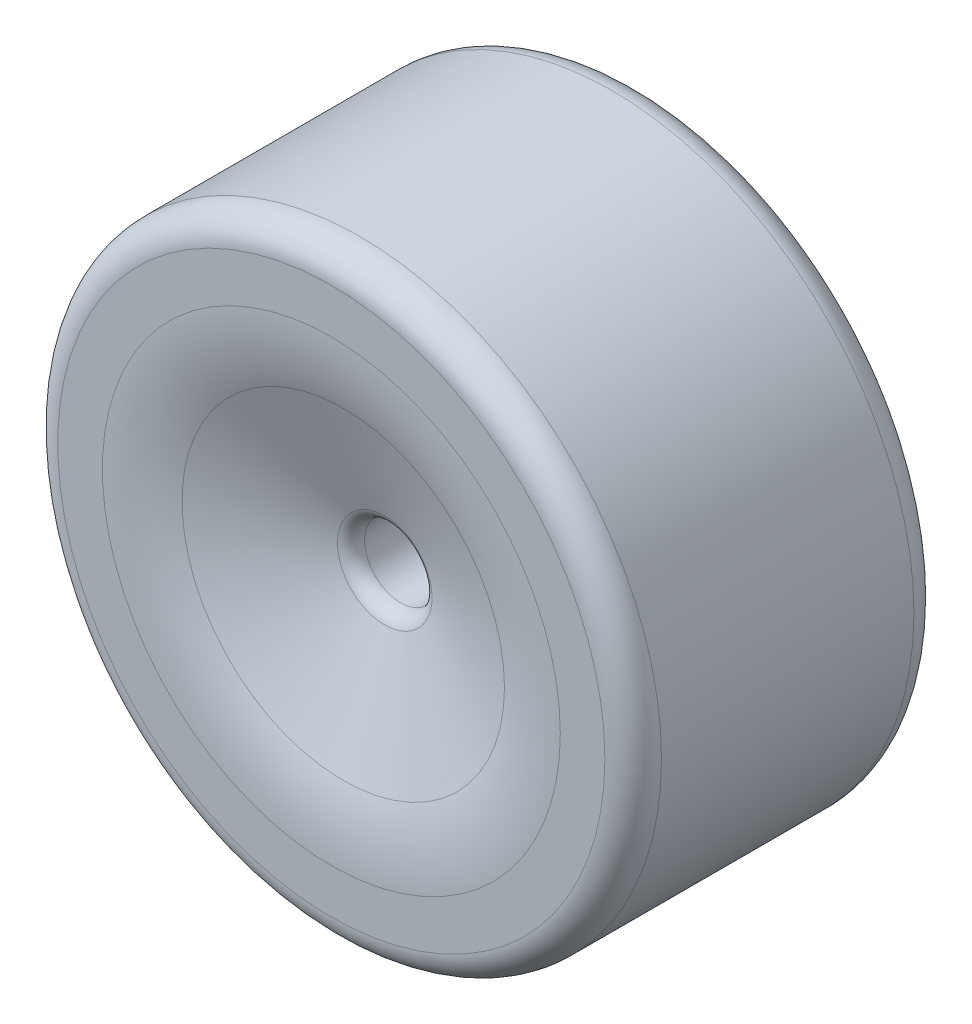
ISO-10303-21;
HEADER;
FILE_DESCRIPTION(('STEP AP214'),'2;1');
FILE_NAME('part.step','',(''),(''),'','','');
FILE_SCHEMA(('AUTOMOTIVE_DESIGN { 1 0 10303 214 1 1 1 1 }'));
ENDSEC;
DATA;
#1=APPLICATION_CONTEXT('core data for automotive mechanical design processes');
#2=APPLICATION_PROTOCOL_DEFINITION('international standard','automotive_design',2000,#1);
#3=PRODUCT_CONTEXT('',#1,'mechanical');
#4=PRODUCT('Part','Part','',(#3));
#5=PRODUCT_RELATED_PRODUCT_CATEGORY('part','',(#4));
#6=PRODUCT_DEFINITION_FORMATION('','',#4);
#7=PRODUCT_DEFINITION_CONTEXT('part definition',#1,'design');
#8=PRODUCT_DEFINITION('design','',#6,#7);
#9=PRODUCT_DEFINITION_SHAPE('','',#8);
#10=(LENGTH_UNIT() NAMED_UNIT(*) SI_UNIT(.MILLI.,.METRE.));
#11=(NAMED_UNIT(*) PLANE_ANGLE_UNIT() SI_UNIT($,.RADIAN.));
#12=(NAMED_UNIT(*) SI_UNIT($,.STERADIAN.) SOLID_ANGLE_UNIT());
#13=UNCERTAINTY_MEASURE_WITH_UNIT(LENGTH_MEASURE(1.E-05),#10,'distance_accuracy_value','');
#14=(GEOMETRIC_REPRESENTATION_CONTEXT(3) GLOBAL_UNCERTAINTY_ASSIGNED_CONTEXT((#13)) GLOBAL_UNIT_ASSIGNED_CONTEXT((#10,
#11,#12)) REPRESENTATION_CONTEXT('',''));
#15=CARTESIAN_POINT('',(0.,0.,0.));
#16=DIRECTION('',(0.,0.,1.));
#17=DIRECTION('',(1.,0.,0.));
#18=AXIS2_PLACEMENT_3D('',#15,#16,#17);
#19=CARTESIAN_POINT('',(0.,0.,54.61));
#20=DIRECTION('',(0.,0.,-1.));
#21=DIRECTION('',(-1.,0.,0.));
#22=AXIS2_PLACEMENT_3D('',#19,#20,#21);
#23=CYLINDRICAL_SURFACE('',#22,53.34);
#24=CARTESIAN_POINT('',(0.,0.,5.));
#25=DIRECTION('',(0.,0.,1.));
#26=DIRECTION('',(1.,0.,0.));
#27=AXIS2_PLACEMENT_3D('',#24,#25,#26);
#28=CIRCLE('',#27,53.34);
#29=CARTESIAN_POINT('',(53.34,0.,5.));
#30=VERTEX_POINT('',#29);
#31=EDGE_CURVE('E61',#30,#30,#28,.T.);
#32=ORIENTED_EDGE('',*,*,#31,.T.);
#33=EDGE_LOOP('',(#32));
#34=FACE_BOUND('',#33,.T.);
#35=CARTESIAN_POINT('',(0.,0.,49.61));
#36=DIRECTION('',(0.,0.,1.));
#37=DIRECTION('',(1.,0.,0.));
#38=AXIS2_PLACEMENT_3D('',#35,#36,#37);
#39=CIRCLE('',#38,53.34);
#40=CARTESIAN_POINT('',(53.34,0.,49.61));
#41=VERTEX_POINT('',#40);
#42=EDGE_CURVE('E64',#41,#41,#39,.F.);
#43=ORIENTED_EDGE('',*,*,#42,.T.);
#44=EDGE_LOOP('',(#43));
#45=FACE_BOUND('',#44,.T.);
#46=ADVANCED_FACE('F29',(#34,#45),#23,.T.);
#47=CARTESIAN_POINT('',(0.,0.,54.61));
#48=DIRECTION('',(0.,0.,1.));
#49=DIRECTION('',(1.,0.,0.));
#50=AXIS2_PLACEMENT_3D('',#47,#48,#49);
#51=PLANE('',#50);
#52=CARTESIAN_POINT('',(0.,0.,54.61));
#53=DIRECTION('',(0.,0.,1.));
#54=DIRECTION('',(1.,0.,0.));
#55=AXIS2_PLACEMENT_3D('',#52,#53,#54);
#56=CIRCLE('',#55,40.4614443247963);
#57=CARTESIAN_POINT('',(40.4614443247963,0.,54.61));
#58=VERTEX_POINT('',#57);
#59=EDGE_CURVE('E40',#58,#58,#56,.F.);
#60=ORIENTED_EDGE('',*,*,#59,.T.);
#61=EDGE_LOOP('',(#60));
#62=FACE_BOUND('',#61,.T.);
#63=CARTESIAN_POINT('',(0.,0.,54.61));
#64=DIRECTION('',(0.,0.,1.));
#65=DIRECTION('',(1.,0.,0.));
#66=AXIS2_PLACEMENT_3D('',#63,#64,#65);
#67=CIRCLE('',#66,48.34);
#68=CARTESIAN_POINT('',(48.34,0.,54.61));
#69=VERTEX_POINT('',#68);
#70=EDGE_CURVE('E55',#69,#69,#67,.T.);
#71=ORIENTED_EDGE('',*,*,#70,.T.);
#72=EDGE_LOOP('',(#71));
#73=FACE_BOUND('',#72,.T.);
#74=ADVANCED_FACE('F89',(#62,#73),#51,.T.);
#75=CARTESIAN_POINT('',(0.,0.,0.));
#76=DIRECTION('',(0.,0.,1.));
#77=DIRECTION('',(1.,0.,0.));
#78=AXIS2_PLACEMENT_3D('',#75,#76,#77);
#79=PLANE('',#78);
#80=CARTESIAN_POINT('',(0.,0.,0.));
#81=DIRECTION('',(0.,0.,1.));
#82=DIRECTION('',(1.,0.,0.));
#83=AXIS2_PLACEMENT_3D('',#80,#81,#82);
#84=CIRCLE('',#83,29.432);
#85=CARTESIAN_POINT('',(29.432,0.,0.));
#86=VERTEX_POINT('',#85);
#87=EDGE_CURVE('E49',#86,#86,#84,.T.);
#88=ORIENTED_EDGE('',*,*,#87,.T.);
#89=EDGE_LOOP('',(#88));
#90=FACE_BOUND('',#89,.T.);
#91=CARTESIAN_POINT('',(0.,0.,0.));
#92=DIRECTION('',(0.,0.,1.));
#93=DIRECTION('',(1.,0.,0.));
#94=AXIS2_PLACEMENT_3D('',#91,#92,#93);
#95=CIRCLE('',#94,48.34);
#96=CARTESIAN_POINT('',(48.34,0.,0.));
#97=VERTEX_POINT('',#96);
#98=EDGE_CURVE('E58',#97,#97,#95,.F.);
#99=ORIENTED_EDGE('',*,*,#98,.T.);
#100=EDGE_LOOP('',(#99));
#101=FACE_BOUND('',#100,.T.);
#102=ADVANCED_FACE('F95',(#90,#101),#79,.F.);
#103=CARTESIAN_POINT('',(0.,0.,5.));
#104=DIRECTION('',(0.,0.,1.));
#105=DIRECTION('',(1.,0.,0.));
#106=AXIS2_PLACEMENT_3D('',#103,#104,#105);
#107=TOROIDAL_SURFACE('',#106,48.34,5.);
#108=ORIENTED_EDGE('',*,*,#98,.F.);
#109=EDGE_LOOP('',(#108));
#110=FACE_BOUND('',#109,.T.);
#111=ORIENTED_EDGE('',*,*,#31,.F.);
#112=EDGE_LOOP('',(#111));
#113=FACE_BOUND('',#112,.T.);
#114=ADVANCED_FACE('F101',(#110,#113),#107,.T.);
#115=CARTESIAN_POINT('',(0.,0.,49.61));
#116=DIRECTION('',(0.,0.,1.));
#117=DIRECTION('',(1.,0.,0.));
#118=AXIS2_PLACEMENT_3D('',#115,#116,#117);
#119=TOROIDAL_SURFACE('',#118,48.34,5.);
#120=ORIENTED_EDGE('',*,*,#42,.F.);
#121=EDGE_LOOP('',(#120));
#122=FACE_BOUND('',#121,.T.);
#123=ORIENTED_EDGE('',*,*,#70,.F.);
#124=EDGE_LOOP('',(#123));
#125=FACE_BOUND('',#124,.T.);
#126=ADVANCED_FACE('F104',(#122,#125),#119,.T.);
#127=CARTESIAN_POINT('',(0.,0.,17.78));
#128=DIRECTION('',(0.,0.,-1.));
#129=DIRECTION('',(-1.,0.,0.));
#130=AXIS2_PLACEMENT_3D('',#127,#128,#129);
#131=CYLINDRICAL_SURFACE('',#130,27.432);
#132=CARTESIAN_POINT('',(0.,0.,2.));
#133=DIRECTION('',(0.,0.,1.));
#134=DIRECTION('',(1.,0.,0.));
#135=AXIS2_PLACEMENT_3D('',#132,#133,#134);
#136=CIRCLE('',#135,27.432);
#137=CARTESIAN_POINT('',(27.432,0.,2.));
#138=VERTEX_POINT('',#137);
#139=EDGE_CURVE('E52',#138,#138,#136,.F.);
#140=ORIENTED_EDGE('',*,*,#139,.T.);
#141=EDGE_LOOP('',(#140));
#142=FACE_BOUND('',#141,.T.);
#143=CARTESIAN_POINT('',(0.,0.,17.78));
#144=DIRECTION('',(0.,0.,-1.));
#145=DIRECTION('',(-1.,0.,0.));
#146=AXIS2_PLACEMENT_3D('',#143,#144,#145);
#147=CIRCLE('',#146,27.432);
#148=CARTESIAN_POINT('',(-27.432,0.,17.78));
#149=VERTEX_POINT('',#148);
#150=EDGE_CURVE('E67',#149,#149,#147,.T.);
#151=ORIENTED_EDGE('',*,*,#150,.F.);
#152=EDGE_LOOP('',(#151));
#153=FACE_BOUND('',#152,.T.);
#154=ADVANCED_FACE('F108',(#142,#153),#131,.F.);
#155=CARTESIAN_POINT('',(0.,0.,17.78));
#156=DIRECTION('',(0.,0.,-1.));
#157=DIRECTION('',(-1.,0.,0.));
#158=AXIS2_PLACEMENT_3D('',#155,#156,#157);
#159=PLANE('',#158);
#160=ORIENTED_EDGE('',*,*,#150,.T.);
#161=EDGE_LOOP('',(#160));
#162=FACE_BOUND('',#161,.T.);
#163=ADVANCED_FACE('F112',(#162),#159,.T.);
#164=CARTESIAN_POINT('',(0.,0.,2.));
#165=DIRECTION('',(0.,0.,1.));
#166=DIRECTION('',(1.,0.,0.));
#167=AXIS2_PLACEMENT_3D('',#164,#165,#166);
#168=TOROIDAL_SURFACE('',#167,29.432,2.);
#169=ORIENTED_EDGE('',*,*,#87,.F.);
#170=EDGE_LOOP('',(#169));
#171=FACE_BOUND('',#170,.T.);
#172=ORIENTED_EDGE('',*,*,#139,.F.);
#173=EDGE_LOOP('',(#172));
#174=FACE_BOUND('',#173,.T.);
#175=ADVANCED_FACE('F110',(#171,#174),#168,.T.);
#176=CARTESIAN_POINT('',(0.,0.,54.61));
#177=DIRECTION('',(0.,0.,1.));
#178=DIRECTION('',(1.,0.,0.));
#179=AXIS2_PLACEMENT_3D('',#176,#177,#178);
#180=CONICAL_SURFACE('',#179,34.29,1.22173047639603);
#181=CARTESIAN_POINT('',(0.,0.,45.1684552477286));
#182=DIRECTION('',(0.,0.,-1.));
#183=DIRECTION('',(-1.,0.,0.));
#184=AXIS2_PLACEMENT_3D('',#181,#182,#183);
#185=CIRCLE('',#184,8.34956898836392);
#186=CARTESIAN_POINT('',(8.34956898836393,0.,45.1684552477286));
#187=VERTEX_POINT('',#186);
#188=EDGE_CURVE('E10',#187,#187,#185,.T.);
#189=CARTESIAN_POINT('',(0.,0.,52.4992417275068));
#190=DIRECTION('',(0.,0.,1.));
#191=DIRECTION('',(1.,0.,0.));
#192=AXIS2_PLACEMENT_3D('',#189,#190,#191);
#193=CIRCLE('',#192,28.4907393083979);
#194=CARTESIAN_POINT('',(28.4907393083979,0.,52.4992417275068));
#195=VERTEX_POINT('',#194);
#196=EDGE_CURVE('E44',#195,#195,#193,.T.);
#197=CARTESIAN_POINT('',(8.34956898836393,0.,45.1684552477286));
#198=CARTESIAN_POINT('',(8.55937284586429,0.,45.244817606893));
#199=CARTESIAN_POINT('',(8.76917670336464,0.,45.3211799660573));
#200=CARTESIAN_POINT('',(9.18878441836534,0.,45.473904684386));
#201=CARTESIAN_POINT('',(9.3985882758657,0.,45.5502670435504));
#202=CARTESIAN_POINT('',(9.81819599086641,0.,45.7029917618791));
#203=CARTESIAN_POINT('',(10.0279998483668,0.,45.7793541210434));
#204=CARTESIAN_POINT('',(10.4476075633675,0.,45.9320788393722));
#205=CARTESIAN_POINT('',(10.6574114208678,0.,46.0084411985365));
#206=CARTESIAN_POINT('',(11.0770191358685,0.,46.1611659168652));
#207=CARTESIAN_POINT('',(11.2868229933689,0.,46.2375282760296));
#208=CARTESIAN_POINT('',(11.7064307083696,0.,46.3902529943583));
#209=CARTESIAN_POINT('',(11.9162345658699,0.,46.4666153535226));
#210=CARTESIAN_POINT('',(12.3358422808707,0.,46.6193400718514));
#211=CARTESIAN_POINT('',(12.545646138371,0.,46.6957024310157));
#212=CARTESIAN_POINT('',(12.9652538533717,0.,46.8484271493444));
#213=CARTESIAN_POINT('',(13.1750577108721,0.,46.9247895085088));
#214=CARTESIAN_POINT('',(13.5946654258728,0.,47.0775142268375));
#215=CARTESIAN_POINT('',(13.8044692833731,0.,47.1538765860019));
#216=CARTESIAN_POINT('',(14.2240769983738,0.,47.3066013043306));
#217=CARTESIAN_POINT('',(14.4338808558742,0.,47.3829636634949));
#218=CARTESIAN_POINT('',(14.8534885708749,0.,47.5356883818236));
#219=CARTESIAN_POINT('',(15.0632924283752,0.,47.612050740988));
#220=CARTESIAN_POINT('',(15.482900143376,0.,47.7647754593167));
#221=CARTESIAN_POINT('',(15.6927040008763,0.,47.8411378184811));
#222=CARTESIAN_POINT('',(16.112311715877,0.,47.9938625368098));
#223=CARTESIAN_POINT('',(16.3221155733774,0.,48.0702248959741));
#224=CARTESIAN_POINT('',(16.7417232883781,0.,48.2229496143028));
#225=CARTESIAN_POINT('',(16.9515271458784,0.,48.2993119734672));
#226=CARTESIAN_POINT('',(17.3711348608791,0.,48.4520366917959));
#227=CARTESIAN_POINT('',(17.5809387183795,0.,48.5283990509603));
#228=CARTESIAN_POINT('',(18.0005464333802,0.,48.681123769289));
#229=CARTESIAN_POINT('',(18.2103502908806,0.,48.7574861284533));
#230=CARTESIAN_POINT('',(18.6299580058813,0.,48.910210846782));
#231=CARTESIAN_POINT('',(18.8397618633816,0.,48.9865732059464));
#232=CARTESIAN_POINT('',(19.2593695783823,0.,49.1392979242751));
#233=CARTESIAN_POINT('',(19.4691734358827,0.,49.2156602834395));
#234=CARTESIAN_POINT('',(19.8887811508834,0.,49.3683850017682));
#235=CARTESIAN_POINT('',(20.0985850083837,0.,49.4447473609326));
#236=CARTESIAN_POINT('',(20.5181927233844,0.,49.5974720792613));
#237=CARTESIAN_POINT('',(20.7279965808848,0.,49.6738344384256));
#238=CARTESIAN_POINT('',(21.1476042958855,0.,49.8265591567543));
#239=CARTESIAN_POINT('',(21.3574081533859,0.,49.9029215159187));
#240=CARTESIAN_POINT('',(21.7770158683866,0.,50.0556462342474));
#241=CARTESIAN_POINT('',(21.9868197258869,0.,50.1320085934118));
#242=CARTESIAN_POINT('',(22.4064274408876,0.,50.2847333117405));
#243=CARTESIAN_POINT('',(22.616231298388,0.,50.3610956709048));
#244=CARTESIAN_POINT('',(23.0358390133887,0.,50.5138203892335));
#245=CARTESIAN_POINT('',(23.245642870889,0.,50.5901827483979));
#246=CARTESIAN_POINT('',(23.6652505858897,0.,50.7429074667266));
#247=CARTESIAN_POINT('',(23.8750544433901,0.,50.819269825891));
#248=CARTESIAN_POINT('',(24.2946621583908,0.,50.9719945442197));
#249=CARTESIAN_POINT('',(24.5044660158912,0.,51.048356903384));
#250=CARTESIAN_POINT('',(24.9240737308919,0.,51.2010816217127));
#251=CARTESIAN_POINT('',(25.1338775883922,0.,51.2774439808771));
#252=CARTESIAN_POINT('',(25.5534853033929,0.,51.4301686992058));
#253=CARTESIAN_POINT('',(25.7632891608933,0.,51.5065310583702));
#254=CARTESIAN_POINT('',(26.182896875894,0.,51.6592557766989));
#255=CARTESIAN_POINT('',(26.3927007333943,0.,51.7356181358632));
#256=CARTESIAN_POINT('',(26.812308448395,0.,51.8883428541919));
#257=CARTESIAN_POINT('',(27.0221123058954,0.,51.9647052133563));
#258=CARTESIAN_POINT('',(27.4417200208961,0.,52.117429931685));
#259=CARTESIAN_POINT('',(27.6515238783965,0.,52.1937922908494));
#260=CARTESIAN_POINT('',(28.0711315933972,0.,52.3465170091781));
#261=CARTESIAN_POINT('',(28.2809354508975,0.,52.4228793683424));
#262=CARTESIAN_POINT('',(28.4907393083979,0.,52.4992417275068));
#263=B_SPLINE_CURVE_WITH_KNOTS('',3,(#197,#198,#199,#200,#201,#202,#203,#204,#205,#206,#207,
#208,#209,#210,#211,#212,#213,#214,#215,#216,#217,#218,#219,#220,#221,#222,#223,#224,#225,#226,
#227,#228,#229,#230,#231,#232,#233,#234,#235,#236,#237,#238,#239,#240,#241,#242,#243,#244,#245,
#246,#247,#248,#249,#250,#251,#252,#253,#254,#255,#256,#257,#258,#259,#260,#261,#262),
.UNSPECIFIED.,.F.,.F.,(4,2,2,2,2,2,2,2,2,2,2,2,2,2,2,2,2,2,2,2,2,2,2,2,2,2,2,2,2,2,2,2,4),(0.,
0.669805805194734,1.33961161038947,2.00941741558422,2.67922322077896,3.34902902597369,
4.01883483116844,4.68864063636318,5.35844644155792,6.02825224675266,6.6980580519474,
7.36786385714214,8.03766966233687,8.70747546753161,9.37728127272636,10.0470870779211,
10.7168928831158,11.3866986883106,12.0565044935053,12.7263102987001,13.3961161038948,
14.0659219090895,14.7357277142843,15.405533519479,16.0753393246738,16.7451451298685,
17.4149509350632,18.084756740258,18.7545625454527,19.4243683506474,20.0941741558422,
20.7639799610369,21.4337857662317),.UNSPECIFIED.);
#264=EDGE_CURVE('BSEAM85',#187,#195,#263,.T.);
#265=ORIENTED_EDGE('',*,*,#188,.T.);
#266=ORIENTED_EDGE('',*,*,#196,.T.);
#267=ORIENTED_EDGE('',*,*,#264,.T.);
#268=ORIENTED_EDGE('',*,*,#264,.F.);
#269=EDGE_LOOP('',(#265,#267,#266,#268));
#270=FACE_BOUND('',#269,.T.);
#271=ADVANCED_FACE('F85',(#270),#180,.F.);
#272=CARTESIAN_POINT('',(0.,0.,19.61));
#273=DIRECTION('',(0.,0.,1.));
#274=DIRECTION('',(1.,0.,0.));
#275=AXIS2_PLACEMENT_3D('',#272,#273,#274);
#276=TOROIDAL_SURFACE('',#275,40.4614443247963,35.);
#277=ORIENTED_EDGE('',*,*,#59,.F.);
#278=EDGE_LOOP('',(#277));
#279=FACE_BOUND('',#278,.T.);
#280=ORIENTED_EDGE('',*,*,#196,.F.);
#281=EDGE_LOOP('',(#280));
#282=FACE_BOUND('',#281,.T.);
#283=ADVANCED_FACE('F78',(#279,#282),#276,.T.);
#284=CARTESIAN_POINT('',(0.,0.,29.21));
#285=DIRECTION('',(0.,0.,1.));
#286=DIRECTION('',(1.,0.,0.));
#287=AXIS2_PLACEMENT_3D('',#284,#285,#286);
#288=CYLINDRICAL_SURFACE('',#287,6.37562941834092);
#289=CARTESIAN_POINT('',(0.,0.,42.3493773853709));
#290=DIRECTION('',(0.,0.,-1.));
#291=DIRECTION('',(-1.,0.,0.));
#292=AXIS2_PLACEMENT_3D('',#289,#290,#291);
#293=CIRCLE('',#292,6.37562941834092);
#294=CARTESIAN_POINT('',(6.37562941834092,0.,42.3493773853709));
#295=VERTEX_POINT('',#294);
#296=EDGE_CURVE('E36',#295,#295,#293,.F.);
#297=CARTESIAN_POINT('',(0.,0.,29.21));
#298=DIRECTION('',(0.,0.,1.));
#299=DIRECTION('',(1.,0.,0.));
#300=AXIS2_PLACEMENT_3D('',#297,#298,#299);
#301=CIRCLE('',#300,6.37562941834092);
#302=CARTESIAN_POINT('',(6.37562941834092,0.,29.21));
#303=VERTEX_POINT('',#302);
#304=EDGE_CURVE('E70',#303,#303,#301,.T.);
#305=CARTESIAN_POINT('',(6.37562941834092,0.,42.3493773853709));
#306=CARTESIAN_POINT('',(6.37562941834092,0.,42.2125088709399));
#307=CARTESIAN_POINT('',(6.37562941834092,0.,42.075640356509));
#308=CARTESIAN_POINT('',(6.37562941834092,0.,41.8019033276471));
#309=CARTESIAN_POINT('',(6.37562941834092,0.,41.6650348132161));
#310=CARTESIAN_POINT('',(6.37562941834092,0.,41.3912977843543));
#311=CARTESIAN_POINT('',(6.37562941834092,0.,41.2544292699233));
#312=CARTESIAN_POINT('',(6.37562941834092,0.,40.9806922410614));
#313=CARTESIAN_POINT('',(6.37562941834092,0.,40.8438237266305));
#314=CARTESIAN_POINT('',(6.37562941834092,0.,40.5700866977686));
#315=CARTESIAN_POINT('',(6.37562941834092,0.,40.4332181833376));
#316=CARTESIAN_POINT('',(6.37562941834092,0.,40.1594811544757));
#317=CARTESIAN_POINT('',(6.37562941834092,0.,40.0226126400448));
#318=CARTESIAN_POINT('',(6.37562941834092,0.,39.7488756111829));
#319=CARTESIAN_POINT('',(6.37562941834092,0.,39.6120070967519));
#320=CARTESIAN_POINT('',(6.37562941834092,0.,39.33827006789));
#321=CARTESIAN_POINT('',(6.37562941834092,0.,39.2014015534591));
#322=CARTESIAN_POINT('',(6.37562941834092,0.,38.9276645245972));
#323=CARTESIAN_POINT('',(6.37562941834092,0.,38.7907960101663));
#324=CARTESIAN_POINT('',(6.37562941834092,0.,38.5170589813044));
#325=CARTESIAN_POINT('',(6.37562941834092,0.,38.3801904668734));
#326=CARTESIAN_POINT('',(6.37562941834092,0.,38.1064534380115));
#327=CARTESIAN_POINT('',(6.37562941834092,0.,37.9695849235806));
#328=CARTESIAN_POINT('',(6.37562941834092,0.,37.6958478947187));
#329=CARTESIAN_POINT('',(6.37562941834092,0.,37.5589793802877));
#330=CARTESIAN_POINT('',(6.37562941834092,0.,37.2852423514259));
#331=CARTESIAN_POINT('',(6.37562941834092,0.,37.1483738369949));
#332=CARTESIAN_POINT('',(6.37562941834092,0.,36.874636808133));
#333=CARTESIAN_POINT('',(6.37562941834092,0.,36.7377682937021));
#334=CARTESIAN_POINT('',(6.37562941834092,0.,36.4640312648402));
#335=CARTESIAN_POINT('',(6.37562941834092,0.,36.3271627504092));
#336=CARTESIAN_POINT('',(6.37562941834092,0.,36.0534257215473));
#337=CARTESIAN_POINT('',(6.37562941834092,0.,35.9165572071164));
#338=CARTESIAN_POINT('',(6.37562941834092,0.,35.6428201782545));
#339=CARTESIAN_POINT('',(6.37562941834092,0.,35.5059516638235));
#340=CARTESIAN_POINT('',(6.37562941834092,0.,35.2322146349617));
#341=CARTESIAN_POINT('',(6.37562941834092,0.,35.0953461205307));
#342=CARTESIAN_POINT('',(6.37562941834092,0.,34.8216090916688));
#343=CARTESIAN_POINT('',(6.37562941834092,0.,34.6847405772379));
#344=CARTESIAN_POINT('',(6.37562941834092,0.,34.411003548376));
#345=CARTESIAN_POINT('',(6.37562941834092,0.,34.274135033945));
#346=CARTESIAN_POINT('',(6.37562941834092,0.,34.0003980050831));
#347=CARTESIAN_POINT('',(6.37562941834092,0.,33.8635294906522));
#348=CARTESIAN_POINT('',(6.37562941834092,0.,33.5897924617903));
#349=CARTESIAN_POINT('',(6.37562941834092,0.,33.4529239473593));
#350=CARTESIAN_POINT('',(6.37562941834092,0.,33.1791869184975));
#351=CARTESIAN_POINT('',(6.37562941834092,0.,33.0423184040665));
#352=CARTESIAN_POINT('',(6.37562941834092,0.,32.7685813752046));
#353=CARTESIAN_POINT('',(6.37562941834092,0.,32.6317128607737));
#354=CARTESIAN_POINT('',(6.37562941834092,0.,32.3579758319118));
#355=CARTESIAN_POINT('',(6.37562941834092,0.,32.2211073174808));
#356=CARTESIAN_POINT('',(6.37562941834092,0.,31.9473702886189));
#357=CARTESIAN_POINT('',(6.37562941834092,0.,31.810501774188));
#358=CARTESIAN_POINT('',(6.37562941834092,0.,31.5367647453261));
#359=CARTESIAN_POINT('',(6.37562941834092,0.,31.3998962308951));
#360=CARTESIAN_POINT('',(6.37562941834092,0.,31.1261592020333));
#361=CARTESIAN_POINT('',(6.37562941834092,0.,30.9892906876023));
#362=CARTESIAN_POINT('',(6.37562941834092,0.,30.7155536587404));
#363=CARTESIAN_POINT('',(6.37562941834092,0.,30.5786851443095));
#364=CARTESIAN_POINT('',(6.37562941834092,0.,30.3049481154476));
#365=CARTESIAN_POINT('',(6.37562941834092,0.,30.1680796010166));
#366=CARTESIAN_POINT('',(6.37562941834092,0.,29.8943425721547));
#367=CARTESIAN_POINT('',(6.37562941834092,0.,29.7574740577238));
#368=CARTESIAN_POINT('',(6.37562941834092,0.,29.4837370288619));
#369=CARTESIAN_POINT('',(6.37562941834092,0.,29.3468685144309));
#370=CARTESIAN_POINT('',(6.37562941834092,0.,29.21));
#371=B_SPLINE_CURVE_WITH_KNOTS('',3,(#305,#306,#307,#308,#309,#310,#311,#312,#313,#314,#315,
#316,#317,#318,#319,#320,#321,#322,#323,#324,#325,#326,#327,#328,#329,#330,#331,#332,#333,#334,
#335,#336,#337,#338,#339,#340,#341,#342,#343,#344,#345,#346,#347,#348,#349,#350,#351,#352,#353,
#354,#355,#356,#357,#358,#359,#360,#361,#362,#363,#364,#365,#366,#367,#368,#369,#370),
.UNSPECIFIED.,.F.,.F.,(4,2,2,2,2,2,2,2,2,2,2,2,2,2,2,2,2,2,2,2,2,2,2,2,2,2,2,2,2,2,2,2,4),(0.,
0.410605543292843,0.821211086585678,1.23181662987852,1.64242217317136,2.0530277164642,
2.46363325975704,2.87423880304988,3.28484434634272,3.69544988963556,4.1060554329284,
4.51666097622124,4.92726651951408,5.33787206280692,5.74847760609976,6.1590831493926,
6.56968869268544,6.98029423597828,7.39089977927112,7.80150532256395,8.2121108658568,
8.62271640914964,9.03332195244248,9.44392749573532,9.85453303902816,10.265138582321,
10.6757441256138,11.0863496689067,11.4969552121995,11.9075607554924,12.3181662987852,
12.728771842078,13.1393773853709),.UNSPECIFIED.);
#372=EDGE_CURVE('BSEAM76',#295,#303,#371,.T.);
#373=ORIENTED_EDGE('',*,*,#296,.T.);
#374=ORIENTED_EDGE('',*,*,#304,.F.);
#375=ORIENTED_EDGE('',*,*,#372,.T.);
#376=ORIENTED_EDGE('',*,*,#372,.F.);
#377=EDGE_LOOP('',(#373,#375,#374,#376));
#378=FACE_BOUND('',#377,.T.);
#379=ADVANCED_FACE('F76',(#378),#288,.F.);
#380=CARTESIAN_POINT('',(0.,0.,29.21));
#381=DIRECTION('',(0.,0.,1.));
#382=DIRECTION('',(1.,0.,0.));
#383=AXIS2_PLACEMENT_3D('',#380,#381,#382);
#384=PLANE('',#383);
#385=ORIENTED_EDGE('',*,*,#304,.T.);
#386=EDGE_LOOP('',(#385));
#387=FACE_BOUND('',#386,.T.);
#388=ADVANCED_FACE('F74',(#387),#384,.T.);
#389=CARTESIAN_POINT('',(0.,0.,42.3493773853709));
#390=DIRECTION('',(0.,0.,-1.));
#391=DIRECTION('',(-1.,0.,0.));
#392=AXIS2_PLACEMENT_3D('',#389,#390,#391);
#393=TOROIDAL_SURFACE('',#392,9.37562941834092,3.);
#394=ORIENTED_EDGE('',*,*,#188,.F.);
#395=EDGE_LOOP('',(#394));
#396=FACE_BOUND('',#395,.T.);
#397=ORIENTED_EDGE('',*,*,#296,.F.);
#398=EDGE_LOOP('',(#397));
#399=FACE_BOUND('',#398,.T.);
#400=ADVANCED_FACE('F31',(#396,#399),#393,.T.);
#401=CLOSED_SHELL('',(#46,#74,#102,#114,#126,#154,#163,#175,#271,#283,#379,#388,#400));
#402=MANIFOLD_SOLID_BREP('B2',#401);
#403=ADVANCED_BREP_SHAPE_REPRESENTATION('',(#18,#402),#14);
#404=SHAPE_DEFINITION_REPRESENTATION(#9,#403);
ENDSEC;
END-ISO-10303-21;
